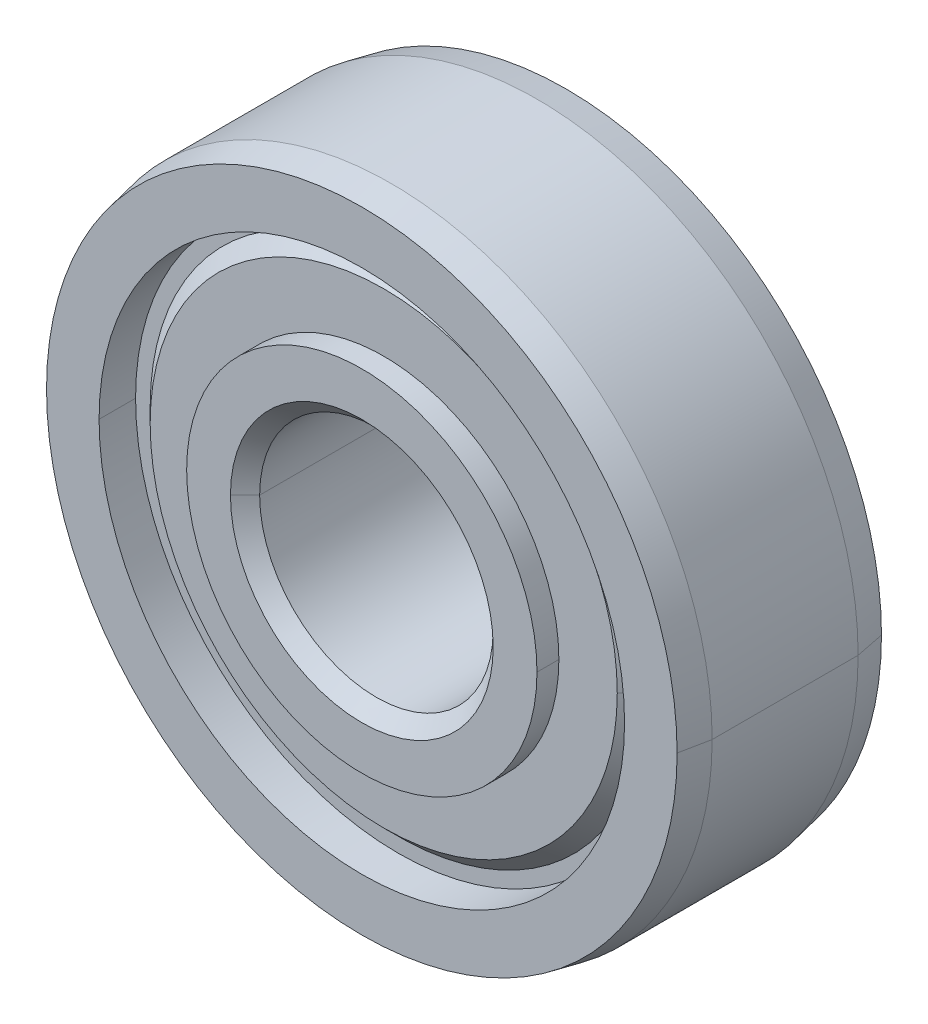
ISO-10303-21;
HEADER;
FILE_DESCRIPTION(('STEP AP214'),'2;1');
FILE_NAME('part.step','',(''),(''),'','','');
FILE_SCHEMA(('AUTOMOTIVE_DESIGN { 1 0 10303 214 1 1 1 1 }'));
ENDSEC;
DATA;
#1=APPLICATION_CONTEXT('core data for automotive mechanical design processes');
#2=APPLICATION_PROTOCOL_DEFINITION('international standard','automotive_design',2000,#1);
#3=PRODUCT_CONTEXT('',#1,'mechanical');
#4=PRODUCT('Part','Part','',(#3));
#5=PRODUCT_RELATED_PRODUCT_CATEGORY('part','',(#4));
#6=PRODUCT_DEFINITION_FORMATION('','',#4);
#7=PRODUCT_DEFINITION_CONTEXT('part definition',#1,'design');
#8=PRODUCT_DEFINITION('design','',#6,#7);
#9=PRODUCT_DEFINITION_SHAPE('','',#8);
#10=(LENGTH_UNIT() NAMED_UNIT(*) SI_UNIT(.MILLI.,.METRE.));
#11=(NAMED_UNIT(*) PLANE_ANGLE_UNIT() SI_UNIT($,.RADIAN.));
#12=(NAMED_UNIT(*) SI_UNIT($,.STERADIAN.) SOLID_ANGLE_UNIT());
#13=UNCERTAINTY_MEASURE_WITH_UNIT(LENGTH_MEASURE(1.E-05),#10,'distance_accuracy_value','');
#14=(GEOMETRIC_REPRESENTATION_CONTEXT(3) GLOBAL_UNCERTAINTY_ASSIGNED_CONTEXT((#13)) GLOBAL_UNIT_ASSIGNED_CONTEXT((#10,
#11,#12)) REPRESENTATION_CONTEXT('',''));
#15=CARTESIAN_POINT('',(0.,0.,0.));
#16=DIRECTION('',(0.,0.,1.));
#17=DIRECTION('',(1.,0.,0.));
#18=AXIS2_PLACEMENT_3D('',#15,#16,#17);
#19=CARTESIAN_POINT('',(0.,0.,-3.5));
#20=DIRECTION('',(0.,0.,1.));
#21=DIRECTION('',(1.,0.,0.));
#22=AXIS2_PLACEMENT_3D('',#19,#20,#21);
#23=PLANE('',#22);
#24=CARTESIAN_POINT('',(0.,0.,-3.5));
#25=DIRECTION('',(0.,0.,-1.));
#26=DIRECTION('',(-1.,0.,0.));
#27=AXIS2_PLACEMENT_3D('',#24,#25,#26);
#28=CIRCLE('',#27,9.);
#29=CARTESIAN_POINT('',(-9.,0.,-3.5));
#30=VERTEX_POINT('',#29);
#31=CARTESIAN_POINT('',(9.,0.,-3.5));
#32=VERTEX_POINT('',#31);
#33=EDGE_CURVE('E229',#30,#32,#28,.T.);
#34=ORIENTED_EDGE('',*,*,#33,.F.);
#35=CARTESIAN_POINT('',(0.,0.,-3.5));
#36=DIRECTION('',(0.,0.,-1.));
#37=DIRECTION('',(1.,0.,0.));
#38=AXIS2_PLACEMENT_3D('',#35,#36,#37);
#39=CIRCLE('',#38,9.);
#40=EDGE_CURVE('E36',#32,#30,#39,.T.);
#41=ORIENTED_EDGE('',*,*,#40,.F.);
#42=EDGE_LOOP('',(#34,#41));
#43=FACE_BOUND('',#42,.T.);
#44=CARTESIAN_POINT('',(0.,0.,-3.5));
#45=DIRECTION('',(0.,0.,-1.));
#46=DIRECTION('',(-1.,0.,0.));
#47=AXIS2_PLACEMENT_3D('',#44,#45,#46);
#48=CIRCLE('',#47,10.8);
#49=CARTESIAN_POINT('',(-10.7999999994736,-5.50684610769266E-07,-3.50000000263162));
#50=VERTEX_POINT('',#49);
#51=CARTESIAN_POINT('',(10.7999999994736,5.50684613076049E-07,-3.50000000263162));
#52=VERTEX_POINT('',#51);
#53=EDGE_CURVE('E10',#50,#52,#48,.T.);
#54=ORIENTED_EDGE('',*,*,#53,.T.);
#55=CARTESIAN_POINT('',(0.,0.,-3.5));
#56=DIRECTION('',(0.,0.,-1.));
#57=DIRECTION('',(1.,0.,0.));
#58=AXIS2_PLACEMENT_3D('',#55,#56,#57);
#59=CIRCLE('',#58,10.8);
#60=EDGE_CURVE('E27',#52,#50,#59,.T.);
#61=ORIENTED_EDGE('',*,*,#60,.T.);
#62=EDGE_LOOP('',(#54,#61));
#63=FACE_BOUND('',#62,.T.);
#64=ADVANCED_FACE('F16',(#43,#63),#23,.F.);
#65=CARTESIAN_POINT('',(0.,0.,-3.5));
#66=DIRECTION('',(0.,0.,-1.));
#67=DIRECTION('',(1.,0.,0.));
#68=AXIS2_PLACEMENT_3D('',#65,#66,#67);
#69=CYLINDRICAL_SURFACE('',#68,9.);
#70=ORIENTED_EDGE('',*,*,#33,.T.);
#71=DIRECTION('',(0.,0.,1.));
#72=VECTOR('',#71,1.);
#73=CARTESIAN_POINT('',(9.,0.,-3.5));
#74=LINE('',#73,#72);
#75=CARTESIAN_POINT('',(9.,0.,-2.25));
#76=VERTEX_POINT('',#75);
#77=EDGE_CURVE('E241',#32,#76,#74,.T.);
#78=ORIENTED_EDGE('',*,*,#77,.T.);
#79=CARTESIAN_POINT('',(0.,0.,-2.25));
#80=DIRECTION('',(0.,0.,1.));
#81=DIRECTION('',(1.,0.,0.));
#82=AXIS2_PLACEMENT_3D('',#79,#80,#81);
#83=CIRCLE('',#82,9.);
#84=CARTESIAN_POINT('',(-9.,0.,-2.25));
#85=VERTEX_POINT('',#84);
#86=EDGE_CURVE('E245',#76,#85,#83,.T.);
#87=ORIENTED_EDGE('',*,*,#86,.T.);
#88=DIRECTION('',(0.,0.,-1.));
#89=VECTOR('',#88,1.);
#90=CARTESIAN_POINT('',(-9.,0.,-2.25));
#91=LINE('',#90,#89);
#92=EDGE_CURVE('E260',#85,#30,#91,.T.);
#93=ORIENTED_EDGE('',*,*,#92,.T.);
#94=EDGE_LOOP('',(#70,#78,#87,#93));
#95=FACE_BOUND('',#94,.T.);
#96=ADVANCED_FACE('F470',(#95),#69,.F.);
#97=CARTESIAN_POINT('',(0.,0.,-3.5));
#98=DIRECTION('',(0.,0.,-1.));
#99=DIRECTION('',(1.,0.,0.));
#100=AXIS2_PLACEMENT_3D('',#97,#98,#99);
#101=CYLINDRICAL_SURFACE('',#100,9.);
#102=ORIENTED_EDGE('',*,*,#40,.T.);
#103=ORIENTED_EDGE('',*,*,#92,.F.);
#104=CARTESIAN_POINT('',(0.,0.,-2.25));
#105=DIRECTION('',(0.,0.,1.));
#106=DIRECTION('',(-1.,0.,0.));
#107=AXIS2_PLACEMENT_3D('',#104,#105,#106);
#108=CIRCLE('',#107,9.);
#109=EDGE_CURVE('E239',#85,#76,#108,.T.);
#110=ORIENTED_EDGE('',*,*,#109,.T.);
#111=ORIENTED_EDGE('',*,*,#77,.F.);
#112=EDGE_LOOP('',(#102,#103,#110,#111));
#113=FACE_BOUND('',#112,.T.);
#114=ADVANCED_FACE('F476',(#113),#101,.F.);
#115=CARTESIAN_POINT('',(0.,0.,-52.5));
#116=DIRECTION('',(0.,0.,1.));
#117=DIRECTION('',(0.,-1.,0.));
#118=AXIS2_PLACEMENT_3D('',#115,#116,#117);
#119=CONICAL_SURFACE('',#118,1.,0.19739555984988);
#120=DIRECTION('',(-0.196116135138183,-2.99994826555368E-08,0.98058067569092));
#121=VECTOR('',#120,1.);
#122=CARTESIAN_POINT('',(-10.7999999984209,-1.6520538323078E-06,-3.50000000789485));
#123=LINE('',#122,#121);
#124=CARTESIAN_POINT('',(-10.9999999995979,-4.20661854438411E-07,-2.50000000201026));
#125=VERTEX_POINT('',#124);
#126=EDGE_CURVE('E235',#50,#125,#123,.T.);
#127=ORIENTED_EDGE('',*,*,#126,.T.);
#128=CARTESIAN_POINT('',(0.,0.,-2.5));
#129=DIRECTION('',(0.,0.,-1.));
#130=DIRECTION('',(-1.,0.,0.));
#131=AXIS2_PLACEMENT_3D('',#128,#129,#130);
#132=CIRCLE('',#131,11.);
#133=CARTESIAN_POINT('',(10.9999999995979,4.20661856200537E-07,-2.50000000201026));
#134=VERTEX_POINT('',#133);
#135=EDGE_CURVE('E240',#125,#134,#132,.T.);
#136=ORIENTED_EDGE('',*,*,#135,.T.);
#137=DIRECTION('',(0.196116135138184,2.99994814602515E-08,0.98058067569092));
#138=VECTOR('',#137,1.);
#139=CARTESIAN_POINT('',(10.7999999984209,1.65205383922815E-06,-3.50000000789485));
#140=LINE('',#139,#138);
#141=EDGE_CURVE('E252',#52,#134,#140,.T.);
#142=ORIENTED_EDGE('',*,*,#141,.F.);
#143=ORIENTED_EDGE('',*,*,#53,.F.);
#144=EDGE_LOOP('',(#127,#136,#142,#143));
#145=FACE_BOUND('',#144,.T.);
#146=ADVANCED_FACE('F483',(#145),#119,.T.);
#147=CARTESIAN_POINT('',(0.,0.,-52.5));
#148=DIRECTION('',(0.,0.,1.));
#149=DIRECTION('',(0.,-1.,0.));
#150=AXIS2_PLACEMENT_3D('',#147,#148,#149);
#151=CONICAL_SURFACE('',#150,1.,0.19739555984988);
#152=ORIENTED_EDGE('',*,*,#141,.T.);
#153=CARTESIAN_POINT('',(0.,0.,-2.5));
#154=DIRECTION('',(0.,0.,-1.));
#155=DIRECTION('',(1.,0.,0.));
#156=AXIS2_PLACEMENT_3D('',#153,#154,#155);
#157=CIRCLE('',#156,11.);
#158=EDGE_CURVE('E256',#134,#125,#157,.T.);
#159=ORIENTED_EDGE('',*,*,#158,.T.);
#160=ORIENTED_EDGE('',*,*,#126,.F.);
#161=ORIENTED_EDGE('',*,*,#60,.F.);
#162=EDGE_LOOP('',(#152,#159,#160,#161));
#163=FACE_BOUND('',#162,.T.);
#164=ADVANCED_FACE('F486',(#163),#151,.T.);
#165=CARTESIAN_POINT('',(0.,0.,-2.25));
#166=DIRECTION('',(0.,0.,1.));
#167=DIRECTION('',(1.,0.,0.));
#168=AXIS2_PLACEMENT_3D('',#165,#166,#167);
#169=PLANE('',#168);
#170=CARTESIAN_POINT('',(0.,0.,-2.25));
#171=DIRECTION('',(0.,0.,-1.));
#172=DIRECTION('',(-1.,0.,0.));
#173=AXIS2_PLACEMENT_3D('',#170,#171,#172);
#174=CIRCLE('',#173,8.5);
#175=CARTESIAN_POINT('',(-8.49999999392348,-3.57447138303924E-07,-2.25000000607649));
#176=VERTEX_POINT('',#175);
#177=CARTESIAN_POINT('',(8.49999999392348,3.57447139280034E-07,-2.25000000607649));
#178=VERTEX_POINT('',#177);
#179=EDGE_CURVE('E271',#176,#178,#174,.T.);
#180=ORIENTED_EDGE('',*,*,#179,.F.);
#181=CARTESIAN_POINT('',(0.,0.,-2.25));
#182=DIRECTION('',(0.,0.,-1.));
#183=DIRECTION('',(1.,0.,0.));
#184=AXIS2_PLACEMENT_3D('',#181,#182,#183);
#185=CIRCLE('',#184,8.5);
#186=EDGE_CURVE('E275',#178,#176,#185,.T.);
#187=ORIENTED_EDGE('',*,*,#186,.F.);
#188=EDGE_LOOP('',(#180,#187));
#189=FACE_BOUND('',#188,.T.);
#190=ORIENTED_EDGE('',*,*,#109,.F.);
#191=ORIENTED_EDGE('',*,*,#86,.F.);
#192=EDGE_LOOP('',(#190,#191));
#193=FACE_BOUND('',#192,.T.);
#194=ADVANCED_FACE('F490',(#189,#193),#169,.F.);
#195=CARTESIAN_POINT('',(0.,0.,-3.5));
#196=DIRECTION('',(0.,0.,-1.));
#197=DIRECTION('',(1.,0.,0.));
#198=AXIS2_PLACEMENT_3D('',#195,#196,#197);
#199=CYLINDRICAL_SURFACE('',#198,11.);
#200=DIRECTION('',(0.,0.,1.));
#201=VECTOR('',#200,1.);
#202=CARTESIAN_POINT('',(11.,0.,-2.5));
#203=LINE('',#202,#201);
#204=CARTESIAN_POINT('',(10.9999999997759,-3.59110547667456E-07,2.50000000112059));
#205=VERTEX_POINT('',#204);
#206=EDGE_CURVE('E270',#134,#205,#203,.T.);
#207=ORIENTED_EDGE('',*,*,#206,.F.);
#208=ORIENTED_EDGE('',*,*,#135,.F.);
#209=DIRECTION('',(0.,0.,1.));
#210=VECTOR('',#209,1.);
#211=CARTESIAN_POINT('',(-11.,0.,-2.5));
#212=LINE('',#211,#210);
#213=CARTESIAN_POINT('',(-10.9999999997759,3.59110548145405E-07,2.50000000112059));
#214=VERTEX_POINT('',#213);
#215=EDGE_CURVE('E294',#125,#214,#212,.T.);
#216=ORIENTED_EDGE('',*,*,#215,.T.);
#217=CARTESIAN_POINT('',(0.,0.,2.5));
#218=DIRECTION('',(0.,0.,1.));
#219=DIRECTION('',(1.,0.,0.));
#220=AXIS2_PLACEMENT_3D('',#217,#218,#219);
#221=CIRCLE('',#220,11.);
#222=EDGE_CURVE('E225',#205,#214,#221,.T.);
#223=ORIENTED_EDGE('',*,*,#222,.F.);
#224=EDGE_LOOP('',(#207,#208,#216,#223));
#225=FACE_BOUND('',#224,.T.);
#226=ADVANCED_FACE('F500',(#225),#199,.T.);
#227=CARTESIAN_POINT('',(0.,0.,-3.5));
#228=DIRECTION('',(0.,0.,-1.));
#229=DIRECTION('',(1.,0.,0.));
#230=AXIS2_PLACEMENT_3D('',#227,#228,#229);
#231=CYLINDRICAL_SURFACE('',#230,11.);
#232=ORIENTED_EDGE('',*,*,#215,.F.);
#233=ORIENTED_EDGE('',*,*,#158,.F.);
#234=ORIENTED_EDGE('',*,*,#206,.T.);
#235=CARTESIAN_POINT('',(0.,0.,2.5));
#236=DIRECTION('',(0.,0.,1.));
#237=DIRECTION('',(-1.,0.,0.));
#238=AXIS2_PLACEMENT_3D('',#235,#236,#237);
#239=CIRCLE('',#238,11.);
#240=EDGE_CURVE('E226',#214,#205,#239,.T.);
#241=ORIENTED_EDGE('',*,*,#240,.F.);
#242=EDGE_LOOP('',(#232,#233,#234,#241));
#243=FACE_BOUND('',#242,.T.);
#244=ADVANCED_FACE('F504',(#243),#231,.T.);
#245=CARTESIAN_POINT('',(0.,0.,-9.75));
#246=DIRECTION('',(0.,0.,1.));
#247=DIRECTION('',(0.,-1.,0.));
#248=AXIS2_PLACEMENT_3D('',#245,#246,#247);
#249=CONICAL_SURFACE('',#248,1.,0.785398163397448);
#250=DIRECTION('',(-0.707106781186542,-8.92070456302929E-08,0.707106781186547));
#251=VECTOR('',#250,1.);
#252=CARTESIAN_POINT('',(-7.99999998284277,-1.00926250815226E-06,-2.75000001715717));
#253=LINE('',#252,#251);
#254=CARTESIAN_POINT('',(-7.99999999428092,-3.36420836050752E-07,-2.75000000571906));
#255=VERTEX_POINT('',#254);
#256=EDGE_CURVE('E266',#255,#176,#253,.T.);
#257=ORIENTED_EDGE('',*,*,#256,.T.);
#258=ORIENTED_EDGE('',*,*,#179,.T.);
#259=DIRECTION('',(0.707106781186542,8.92070458738981E-08,0.707106781186547));
#260=VECTOR('',#259,1.);
#261=CARTESIAN_POINT('',(7.99999998284277,1.00926251090833E-06,-2.75000001715717));
#262=LINE('',#261,#260);
#263=CARTESIAN_POINT('',(7.99999999428092,3.36420836969444E-07,-2.75000000571906));
#264=VERTEX_POINT('',#263);
#265=EDGE_CURVE('E278',#264,#178,#262,.T.);
#266=ORIENTED_EDGE('',*,*,#265,.F.);
#267=CARTESIAN_POINT('',(0.,0.,-2.75));
#268=DIRECTION('',(0.,0.,-1.));
#269=DIRECTION('',(-1.,0.,0.));
#270=AXIS2_PLACEMENT_3D('',#267,#268,#269);
#271=CIRCLE('',#270,8.);
#272=EDGE_CURVE('E314',#255,#264,#271,.T.);
#273=ORIENTED_EDGE('',*,*,#272,.F.);
#274=EDGE_LOOP('',(#257,#258,#266,#273));
#275=FACE_BOUND('',#274,.T.);
#276=ADVANCED_FACE('F496',(#275),#249,.T.);
#277=CARTESIAN_POINT('',(0.,0.,-9.75));
#278=DIRECTION('',(0.,0.,1.));
#279=DIRECTION('',(0.,-1.,0.));
#280=AXIS2_PLACEMENT_3D('',#277,#278,#279);
#281=CONICAL_SURFACE('',#280,1.,0.785398163397448);
#282=ORIENTED_EDGE('',*,*,#265,.T.);
#283=ORIENTED_EDGE('',*,*,#186,.T.);
#284=ORIENTED_EDGE('',*,*,#256,.F.);
#285=CARTESIAN_POINT('',(0.,0.,-2.75));
#286=DIRECTION('',(0.,0.,-1.));
#287=DIRECTION('',(1.,0.,0.));
#288=AXIS2_PLACEMENT_3D('',#285,#286,#287);
#289=CIRCLE('',#288,8.);
#290=EDGE_CURVE('E320',#264,#255,#289,.T.);
#291=ORIENTED_EDGE('',*,*,#290,.F.);
#292=EDGE_LOOP('',(#282,#283,#284,#291));
#293=FACE_BOUND('',#292,.T.);
#294=ADVANCED_FACE('F492',(#293),#281,.T.);
#295=CARTESIAN_POINT('',(0.,0.,52.5));
#296=DIRECTION('',(0.,0.,-1.));
#297=DIRECTION('',(0.,-1.,0.));
#298=AXIS2_PLACEMENT_3D('',#295,#296,#297);
#299=CONICAL_SURFACE('',#298,1.,0.19739555984988);
#300=DIRECTION('',(0.196116135138182,-2.56099536616518E-08,-0.98058067569092));
#301=VECTOR('',#300,1.);
#302=CARTESIAN_POINT('',(10.7999999991197,-1.41032505728514E-06,3.50000000440085));
#303=LINE('',#302,#301);
#304=CARTESIAN_POINT('',(10.7999999997066,-4.7010835242838E-07,3.50000000146695));
#305=VERTEX_POINT('',#304);
#306=EDGE_CURVE('E279',#305,#205,#303,.T.);
#307=ORIENTED_EDGE('',*,*,#306,.T.);
#308=ORIENTED_EDGE('',*,*,#222,.T.);
#309=DIRECTION('',(-0.196116135138182,2.56099500232726E-08,-0.98058067569092));
#310=VECTOR('',#309,1.);
#311=CARTESIAN_POINT('',(-10.7999999991197,1.41032506156025E-06,3.50000000440085));
#312=LINE('',#311,#310);
#313=CARTESIAN_POINT('',(-10.7999999997066,4.70108353853417E-07,3.50000000146695));
#314=VERTEX_POINT('',#313);
#315=EDGE_CURVE('E221',#314,#214,#312,.T.);
#316=ORIENTED_EDGE('',*,*,#315,.F.);
#317=CARTESIAN_POINT('',(0.,0.,3.5));
#318=DIRECTION('',(0.,0.,1.));
#319=DIRECTION('',(1.,0.,0.));
#320=AXIS2_PLACEMENT_3D('',#317,#318,#319);
#321=CIRCLE('',#320,10.8);
#322=EDGE_CURVE('E230',#305,#314,#321,.T.);
#323=ORIENTED_EDGE('',*,*,#322,.F.);
#324=EDGE_LOOP('',(#307,#308,#316,#323));
#325=FACE_BOUND('',#324,.T.);
#326=ADVANCED_FACE('F495',(#325),#299,.T.);
#327=CARTESIAN_POINT('',(0.,0.,52.5));
#328=DIRECTION('',(0.,0.,-1.));
#329=DIRECTION('',(0.,-1.,0.));
#330=AXIS2_PLACEMENT_3D('',#327,#328,#329);
#331=CONICAL_SURFACE('',#330,1.,0.19739555984988);
#332=ORIENTED_EDGE('',*,*,#315,.T.);
#333=ORIENTED_EDGE('',*,*,#240,.T.);
#334=ORIENTED_EDGE('',*,*,#306,.F.);
#335=CARTESIAN_POINT('',(0.,0.,3.5));
#336=DIRECTION('',(0.,0.,1.));
#337=DIRECTION('',(-1.,0.,0.));
#338=AXIS2_PLACEMENT_3D('',#335,#336,#337);
#339=CIRCLE('',#338,10.8);
#340=EDGE_CURVE('E234',#314,#305,#339,.T.);
#341=ORIENTED_EDGE('',*,*,#340,.F.);
#342=EDGE_LOOP('',(#332,#333,#334,#341));
#343=FACE_BOUND('',#342,.T.);
#344=ADVANCED_FACE('F520',(#343),#331,.T.);
#345=CARTESIAN_POINT('',(0.,0.,-2.75));
#346=DIRECTION('',(0.,0.,1.));
#347=DIRECTION('',(1.,0.,0.));
#348=AXIS2_PLACEMENT_3D('',#345,#346,#347);
#349=PLANE('',#348);
#350=ORIENTED_EDGE('',*,*,#272,.T.);
#351=ORIENTED_EDGE('',*,*,#290,.T.);
#352=EDGE_LOOP('',(#350,#351));
#353=FACE_BOUND('',#352,.T.);
#354=CARTESIAN_POINT('',(0.,0.,-2.75));
#355=DIRECTION('',(0.,0.,1.));
#356=DIRECTION('',(-1.,0.,0.));
#357=AXIS2_PLACEMENT_3D('',#354,#355,#356);
#358=CIRCLE('',#357,6.);
#359=CARTESIAN_POINT('',(-6.,0.,-2.75));
#360=VERTEX_POINT('',#359);
#361=CARTESIAN_POINT('',(6.,0.,-2.75));
#362=VERTEX_POINT('',#361);
#363=EDGE_CURVE('E324',#360,#362,#358,.T.);
#364=ORIENTED_EDGE('',*,*,#363,.T.);
#365=CARTESIAN_POINT('',(0.,0.,-2.75));
#366=DIRECTION('',(0.,0.,1.));
#367=DIRECTION('',(1.,0.,0.));
#368=AXIS2_PLACEMENT_3D('',#365,#366,#367);
#369=CIRCLE('',#368,6.);
#370=EDGE_CURVE('E338',#362,#360,#369,.T.);
#371=ORIENTED_EDGE('',*,*,#370,.T.);
#372=EDGE_LOOP('',(#364,#371));
#373=FACE_BOUND('',#372,.T.);
#374=ADVANCED_FACE('F524',(#353,#373),#349,.F.);
#375=CARTESIAN_POINT('',(0.,0.,3.5));
#376=DIRECTION('',(0.,0.,1.));
#377=DIRECTION('',(1.,0.,0.));
#378=AXIS2_PLACEMENT_3D('',#375,#376,#377);
#379=PLANE('',#378);
#380=CARTESIAN_POINT('',(0.,0.,3.5));
#381=DIRECTION('',(0.,0.,-1.));
#382=DIRECTION('',(-1.,0.,0.));
#383=AXIS2_PLACEMENT_3D('',#380,#381,#382);
#384=CIRCLE('',#383,9.);
#385=CARTESIAN_POINT('',(-9.,0.,3.5));
#386=VERTEX_POINT('',#385);
#387=CARTESIAN_POINT('',(9.,0.,3.5));
#388=VERTEX_POINT('',#387);
#389=EDGE_CURVE('E341',#386,#388,#384,.T.);
#390=ORIENTED_EDGE('',*,*,#389,.T.);
#391=CARTESIAN_POINT('',(0.,0.,3.5));
#392=DIRECTION('',(0.,0.,-1.));
#393=DIRECTION('',(1.,0.,0.));
#394=AXIS2_PLACEMENT_3D('',#391,#392,#393);
#395=CIRCLE('',#394,9.);
#396=EDGE_CURVE('E233',#388,#386,#395,.T.);
#397=ORIENTED_EDGE('',*,*,#396,.T.);
#398=EDGE_LOOP('',(#390,#397));
#399=FACE_BOUND('',#398,.T.);
#400=ORIENTED_EDGE('',*,*,#322,.T.);
#401=ORIENTED_EDGE('',*,*,#340,.T.);
#402=EDGE_LOOP('',(#400,#401));
#403=FACE_BOUND('',#402,.T.);
#404=ADVANCED_FACE('F513',(#399,#403),#379,.T.);
#405=CARTESIAN_POINT('',(0.,0.,-3.5));
#406=DIRECTION('',(0.,0.,-1.));
#407=DIRECTION('',(1.,0.,0.));
#408=AXIS2_PLACEMENT_3D('',#405,#406,#407);
#409=CYLINDRICAL_SURFACE('',#408,6.);
#410=DIRECTION('',(0.,0.,1.));
#411=VECTOR('',#410,1.);
#412=CARTESIAN_POINT('',(-6.,0.,-3.5));
#413=LINE('',#412,#411);
#414=CARTESIAN_POINT('',(-6.,0.,-3.5));
#415=VERTEX_POINT('',#414);
#416=EDGE_CURVE('E220',#415,#360,#413,.T.);
#417=ORIENTED_EDGE('',*,*,#416,.F.);
#418=CARTESIAN_POINT('',(0.,0.,-3.5));
#419=DIRECTION('',(0.,0.,1.));
#420=DIRECTION('',(-1.,0.,0.));
#421=AXIS2_PLACEMENT_3D('',#418,#419,#420);
#422=CIRCLE('',#421,6.);
#423=CARTESIAN_POINT('',(6.,0.,-3.5));
#424=VERTEX_POINT('',#423);
#425=EDGE_CURVE('E334',#415,#424,#422,.T.);
#426=ORIENTED_EDGE('',*,*,#425,.T.);
#427=DIRECTION('',(0.,0.,1.));
#428=VECTOR('',#427,1.);
#429=CARTESIAN_POINT('',(6.,0.,-3.5));
#430=LINE('',#429,#428);
#431=EDGE_CURVE('E219',#424,#362,#430,.T.);
#432=ORIENTED_EDGE('',*,*,#431,.T.);
#433=ORIENTED_EDGE('',*,*,#363,.F.);
#434=EDGE_LOOP('',(#417,#426,#432,#433));
#435=FACE_BOUND('',#434,.T.);
#436=ADVANCED_FACE('F509',(#435),#409,.T.);
#437=CARTESIAN_POINT('',(0.,0.,-3.5));
#438=DIRECTION('',(0.,0.,-1.));
#439=DIRECTION('',(1.,0.,0.));
#440=AXIS2_PLACEMENT_3D('',#437,#438,#439);
#441=CYLINDRICAL_SURFACE('',#440,6.);
#442=ORIENTED_EDGE('',*,*,#431,.F.);
#443=CARTESIAN_POINT('',(0.,0.,-3.5));
#444=DIRECTION('',(0.,0.,1.));
#445=DIRECTION('',(1.,0.,0.));
#446=AXIS2_PLACEMENT_3D('',#443,#444,#445);
#447=CIRCLE('',#446,6.);
#448=EDGE_CURVE('E216',#424,#415,#447,.T.);
#449=ORIENTED_EDGE('',*,*,#448,.T.);
#450=ORIENTED_EDGE('',*,*,#416,.T.);
#451=ORIENTED_EDGE('',*,*,#370,.F.);
#452=EDGE_LOOP('',(#442,#449,#450,#451));
#453=FACE_BOUND('',#452,.T.);
#454=ADVANCED_FACE('F512',(#453),#441,.T.);
#455=CARTESIAN_POINT('',(0.,0.,-3.5));
#456=DIRECTION('',(0.,0.,-1.));
#457=DIRECTION('',(1.,0.,0.));
#458=AXIS2_PLACEMENT_3D('',#455,#456,#457);
#459=CYLINDRICAL_SURFACE('',#458,9.);
#460=ORIENTED_EDGE('',*,*,#389,.F.);
#461=DIRECTION('',(0.,0.,-1.));
#462=VECTOR('',#461,1.);
#463=CARTESIAN_POINT('',(-9.,0.,3.5));
#464=LINE('',#463,#462);
#465=CARTESIAN_POINT('',(-9.,0.,2.25));
#466=VERTEX_POINT('',#465);
#467=EDGE_CURVE('E353',#386,#466,#464,.T.);
#468=ORIENTED_EDGE('',*,*,#467,.T.);
#469=CARTESIAN_POINT('',(0.,0.,2.25));
#470=DIRECTION('',(0.,0.,1.));
#471=DIRECTION('',(1.,0.,0.));
#472=AXIS2_PLACEMENT_3D('',#469,#470,#471);
#473=CIRCLE('',#472,9.);
#474=CARTESIAN_POINT('',(9.,0.,2.25));
#475=VERTEX_POINT('',#474);
#476=EDGE_CURVE('E301',#475,#466,#473,.T.);
#477=ORIENTED_EDGE('',*,*,#476,.F.);
#478=DIRECTION('',(0.,0.,1.));
#479=VECTOR('',#478,1.);
#480=CARTESIAN_POINT('',(9.,0.,2.25));
#481=LINE('',#480,#479);
#482=EDGE_CURVE('E284',#475,#388,#481,.T.);
#483=ORIENTED_EDGE('',*,*,#482,.T.);
#484=EDGE_LOOP('',(#460,#468,#477,#483));
#485=FACE_BOUND('',#484,.T.);
#486=ADVANCED_FACE('F528',(#485),#459,.F.);
#487=CARTESIAN_POINT('',(0.,0.,-3.5));
#488=DIRECTION('',(0.,0.,-1.));
#489=DIRECTION('',(1.,0.,0.));
#490=AXIS2_PLACEMENT_3D('',#487,#488,#489);
#491=CYLINDRICAL_SURFACE('',#490,9.);
#492=ORIENTED_EDGE('',*,*,#396,.F.);
#493=ORIENTED_EDGE('',*,*,#482,.F.);
#494=CARTESIAN_POINT('',(0.,0.,2.25));
#495=DIRECTION('',(0.,0.,1.));
#496=DIRECTION('',(-1.,0.,0.));
#497=AXIS2_PLACEMENT_3D('',#494,#495,#496);
#498=CIRCLE('',#497,9.);
#499=EDGE_CURVE('E304',#466,#475,#498,.T.);
#500=ORIENTED_EDGE('',*,*,#499,.F.);
#501=ORIENTED_EDGE('',*,*,#467,.F.);
#502=EDGE_LOOP('',(#492,#493,#500,#501));
#503=FACE_BOUND('',#502,.T.);
#504=ADVANCED_FACE('F534',(#503),#491,.F.);
#505=CARTESIAN_POINT('',(0.,0.,-3.5));
#506=DIRECTION('',(0.,0.,1.));
#507=DIRECTION('',(1.,0.,0.));
#508=AXIS2_PLACEMENT_3D('',#505,#506,#507);
#509=PLANE('',#508);
#510=CARTESIAN_POINT('',(0.,0.,-3.5));
#511=DIRECTION('',(0.,0.,1.));
#512=DIRECTION('',(1.,0.,0.));
#513=AXIS2_PLACEMENT_3D('',#510,#511,#512);
#514=CIRCLE('',#513,4.5);
#515=CARTESIAN_POINT('',(4.49999997643556,-8.34049497778793E-07,-3.49999997643579));
#516=VERTEX_POINT('',#515);
#517=CARTESIAN_POINT('',(-4.49999997643556,8.34049497595097E-07,-3.49999997643579));
#518=VERTEX_POINT('',#517);
#519=EDGE_CURVE('E280',#516,#518,#514,.T.);
#520=ORIENTED_EDGE('',*,*,#519,.T.);
#521=CARTESIAN_POINT('',(0.,0.,-3.5));
#522=DIRECTION('',(0.,0.,1.));
#523=DIRECTION('',(-1.,0.,0.));
#524=AXIS2_PLACEMENT_3D('',#521,#522,#523);
#525=CIRCLE('',#524,4.5);
#526=EDGE_CURVE('E285',#518,#516,#525,.T.);
#527=ORIENTED_EDGE('',*,*,#526,.T.);
#528=EDGE_LOOP('',(#520,#527));
#529=FACE_BOUND('',#528,.T.);
#530=ORIENTED_EDGE('',*,*,#425,.F.);
#531=ORIENTED_EDGE('',*,*,#448,.F.);
#532=EDGE_LOOP('',(#530,#531));
#533=FACE_BOUND('',#532,.T.);
#534=ADVANCED_FACE('F530',(#529,#533),#509,.F.);
#535=CARTESIAN_POINT('',(0.,0.,2.25));
#536=DIRECTION('',(0.,0.,1.));
#537=DIRECTION('',(1.,0.,0.));
#538=AXIS2_PLACEMENT_3D('',#535,#536,#537);
#539=PLANE('',#538);
#540=CARTESIAN_POINT('',(0.,0.,2.25));
#541=DIRECTION('',(0.,0.,1.));
#542=DIRECTION('',(1.,0.,0.));
#543=AXIS2_PLACEMENT_3D('',#540,#541,#542);
#544=CIRCLE('',#543,8.5);
#545=CARTESIAN_POINT('',(8.4999999965269,-3.19631542311548E-07,2.25000000347308));
#546=VERTEX_POINT('',#545);
#547=CARTESIAN_POINT('',(-8.4999999965269,3.19631541964565E-07,2.25000000347308));
#548=VERTEX_POINT('',#547);
#549=EDGE_CURVE('E251',#546,#548,#544,.T.);
#550=ORIENTED_EDGE('',*,*,#549,.F.);
#551=CARTESIAN_POINT('',(0.,0.,2.25));
#552=DIRECTION('',(0.,0.,1.));
#553=DIRECTION('',(-1.,0.,0.));
#554=AXIS2_PLACEMENT_3D('',#551,#552,#553);
#555=CIRCLE('',#554,8.5);
#556=EDGE_CURVE('E261',#548,#546,#555,.T.);
#557=ORIENTED_EDGE('',*,*,#556,.F.);
#558=EDGE_LOOP('',(#550,#557));
#559=FACE_BOUND('',#558,.T.);
#560=ORIENTED_EDGE('',*,*,#499,.T.);
#561=ORIENTED_EDGE('',*,*,#476,.T.);
#562=EDGE_LOOP('',(#560,#561));
#563=FACE_BOUND('',#562,.T.);
#564=ADVANCED_FACE('F533',(#559,#563),#539,.T.);
#565=CARTESIAN_POINT('',(0.,0.,0.));
#566=DIRECTION('',(0.,0.,-1.));
#567=DIRECTION('',(0.,-1.,0.));
#568=AXIS2_PLACEMENT_3D('',#565,#566,#567);
#569=CONICAL_SURFACE('',#568,1.,0.785398163397449);
#570=DIRECTION('',(-0.707106781186439,3.93174708736907E-07,0.707106781186547));
#571=VECTOR('',#570,1.);
#572=CARTESIAN_POINT('',(4.49999992930666,-2.50214849333638E-06,-3.49999992930735));
#573=LINE('',#572,#571);
#574=CARTESIAN_POINT('',(3.99999998429037,-5.56032999231099E-07,-2.99999998429052));
#575=VERTEX_POINT('',#574);
#576=EDGE_CURVE('E305',#516,#575,#573,.T.);
#577=ORIENTED_EDGE('',*,*,#576,.T.);
#578=CARTESIAN_POINT('',(0.,0.,-3.));
#579=DIRECTION('',(0.,0.,1.));
#580=DIRECTION('',(1.,0.,0.));
#581=AXIS2_PLACEMENT_3D('',#578,#579,#580);
#582=CIRCLE('',#581,4.);
#583=CARTESIAN_POINT('',(-3.99999998429037,5.56032998986169E-07,-2.99999998429052));
#584=VERTEX_POINT('',#583);
#585=EDGE_CURVE('E374',#575,#584,#582,.T.);
#586=ORIENTED_EDGE('',*,*,#585,.T.);
#587=DIRECTION('',(0.707106781186438,-3.93174708650313E-07,0.707106781186548));
#588=VECTOR('',#587,1.);
#589=CARTESIAN_POINT('',(-4.49999992930666,2.50214849278529E-06,-3.49999992930735));
#590=LINE('',#589,#588);
#591=EDGE_CURVE('E330',#518,#584,#590,.T.);
#592=ORIENTED_EDGE('',*,*,#591,.F.);
#593=ORIENTED_EDGE('',*,*,#519,.F.);
#594=EDGE_LOOP('',(#577,#586,#592,#593));
#595=FACE_BOUND('',#594,.T.);
#596=ADVANCED_FACE('F550',(#595),#569,.F.);
#597=CARTESIAN_POINT('',(0.,0.,0.));
#598=DIRECTION('',(0.,0.,-1.));
#599=DIRECTION('',(0.,-1.,0.));
#600=AXIS2_PLACEMENT_3D('',#597,#598,#599);
#601=CONICAL_SURFACE('',#600,1.,0.785398163397449);
#602=ORIENTED_EDGE('',*,*,#591,.T.);
#603=CARTESIAN_POINT('',(0.,0.,-3.));
#604=DIRECTION('',(0.,0.,1.));
#605=DIRECTION('',(-1.,0.,0.));
#606=AXIS2_PLACEMENT_3D('',#603,#604,#605);
#607=CIRCLE('',#606,4.);
#608=EDGE_CURVE('E250',#584,#575,#607,.T.);
#609=ORIENTED_EDGE('',*,*,#608,.T.);
#610=ORIENTED_EDGE('',*,*,#576,.F.);
#611=ORIENTED_EDGE('',*,*,#526,.F.);
#612=EDGE_LOOP('',(#602,#609,#610,#611));
#613=FACE_BOUND('',#612,.T.);
#614=ADVANCED_FACE('F554',(#613),#601,.F.);
#615=CARTESIAN_POINT('',(0.,0.,9.75));
#616=DIRECTION('',(0.,0.,-1.));
#617=DIRECTION('',(0.,-1.,0.));
#618=AXIS2_PLACEMENT_3D('',#615,#616,#617);
#619=CONICAL_SURFACE('',#618,1.,0.785398163397448);
#620=DIRECTION('',(0.707106781186542,-7.97695144266721E-08,-0.707106781186549));
#621=VECTOR('',#620,1.);
#622=CARTESIAN_POINT('',(7.99999999019359,-9.02489062420728E-07,2.75000000980635));
#623=LINE('',#622,#621);
#624=CARTESIAN_POINT('',(7.9999999967312,-3.00829687473576E-07,2.75000000326878));
#625=VERTEX_POINT('',#624);
#626=EDGE_CURVE('E246',#625,#546,#623,.T.);
#627=ORIENTED_EDGE('',*,*,#626,.T.);
#628=ORIENTED_EDGE('',*,*,#549,.T.);
#629=DIRECTION('',(-0.707106781186542,7.97695143400763E-08,-0.707106781186549));
#630=VECTOR('',#629,1.);
#631=CARTESIAN_POINT('',(-7.99999999019359,9.02489061441011E-07,2.75000000980635));
#632=LINE('',#631,#630);
#633=CARTESIAN_POINT('',(-7.9999999967312,3.00829687147004E-07,2.75000000326878));
#634=VERTEX_POINT('',#633);
#635=EDGE_CURVE('E264',#634,#548,#632,.T.);
#636=ORIENTED_EDGE('',*,*,#635,.F.);
#637=CARTESIAN_POINT('',(0.,0.,2.75));
#638=DIRECTION('',(0.,0.,1.));
#639=DIRECTION('',(1.,0.,0.));
#640=AXIS2_PLACEMENT_3D('',#637,#638,#639);
#641=CIRCLE('',#640,8.);
#642=EDGE_CURVE('E381',#625,#634,#641,.T.);
#643=ORIENTED_EDGE('',*,*,#642,.F.);
#644=EDGE_LOOP('',(#627,#628,#636,#643));
#645=FACE_BOUND('',#644,.T.);
#646=ADVANCED_FACE('F558',(#645),#619,.T.);
#647=CARTESIAN_POINT('',(0.,0.,9.75));
#648=DIRECTION('',(0.,0.,-1.));
#649=DIRECTION('',(0.,-1.,0.));
#650=AXIS2_PLACEMENT_3D('',#647,#648,#649);
#651=CONICAL_SURFACE('',#650,1.,0.785398163397448);
#652=ORIENTED_EDGE('',*,*,#635,.T.);
#653=ORIENTED_EDGE('',*,*,#556,.T.);
#654=ORIENTED_EDGE('',*,*,#626,.F.);
#655=CARTESIAN_POINT('',(0.,0.,2.75));
#656=DIRECTION('',(0.,0.,1.));
#657=DIRECTION('',(-1.,0.,0.));
#658=AXIS2_PLACEMENT_3D('',#655,#656,#657);
#659=CIRCLE('',#658,8.);
#660=EDGE_CURVE('E202',#634,#625,#659,.T.);
#661=ORIENTED_EDGE('',*,*,#660,.F.);
#662=EDGE_LOOP('',(#652,#653,#654,#661));
#663=FACE_BOUND('',#662,.T.);
#664=ADVANCED_FACE('F562',(#663),#651,.T.);
#665=CARTESIAN_POINT('',(0.,0.,-3.5));
#666=DIRECTION('',(0.,0.,-1.));
#667=DIRECTION('',(1.,0.,0.));
#668=AXIS2_PLACEMENT_3D('',#665,#666,#667);
#669=CYLINDRICAL_SURFACE('',#668,4.);
#670=DIRECTION('',(0.,0.,1.));
#671=VECTOR('',#670,1.);
#672=CARTESIAN_POINT('',(-4.,0.,-3.));
#673=LINE('',#672,#671);
#674=CARTESIAN_POINT('',(-3.99999997592743,-4.61619713892376E-07,2.99999997592754));
#675=VERTEX_POINT('',#674);
#676=EDGE_CURVE('E384',#584,#675,#673,.T.);
#677=ORIENTED_EDGE('',*,*,#676,.F.);
#678=ORIENTED_EDGE('',*,*,#585,.F.);
#679=DIRECTION('',(0.,0.,1.));
#680=VECTOR('',#679,1.);
#681=CARTESIAN_POINT('',(4.,0.,-3.));
#682=LINE('',#681,#680);
#683=CARTESIAN_POINT('',(3.99999997592743,4.61619713892376E-07,2.99999997592754));
#684=VERTEX_POINT('',#683);
#685=EDGE_CURVE('E265',#575,#684,#682,.T.);
#686=ORIENTED_EDGE('',*,*,#685,.T.);
#687=CARTESIAN_POINT('',(0.,0.,3.));
#688=DIRECTION('',(0.,0.,-1.));
#689=DIRECTION('',(-1.,0.,0.));
#690=AXIS2_PLACEMENT_3D('',#687,#688,#689);
#691=CIRCLE('',#690,4.);
#692=EDGE_CURVE('E199',#675,#684,#691,.T.);
#693=ORIENTED_EDGE('',*,*,#692,.F.);
#694=EDGE_LOOP('',(#677,#678,#686,#693));
#695=FACE_BOUND('',#694,.T.);
#696=ADVANCED_FACE('F455',(#695),#669,.F.);
#697=CARTESIAN_POINT('',(0.,0.,-3.5));
#698=DIRECTION('',(0.,0.,-1.));
#699=DIRECTION('',(1.,0.,0.));
#700=AXIS2_PLACEMENT_3D('',#697,#698,#699);
#701=CYLINDRICAL_SURFACE('',#700,4.);
#702=ORIENTED_EDGE('',*,*,#685,.F.);
#703=ORIENTED_EDGE('',*,*,#608,.F.);
#704=ORIENTED_EDGE('',*,*,#676,.T.);
#705=CARTESIAN_POINT('',(0.,0.,3.));
#706=DIRECTION('',(0.,0.,-1.));
#707=DIRECTION('',(1.,0.,0.));
#708=AXIS2_PLACEMENT_3D('',#705,#706,#707);
#709=CIRCLE('',#708,4.);
#710=EDGE_CURVE('E171',#684,#675,#709,.T.);
#711=ORIENTED_EDGE('',*,*,#710,.F.);
#712=EDGE_LOOP('',(#702,#703,#704,#711));
#713=FACE_BOUND('',#712,.T.);
#714=ADVANCED_FACE('F457',(#713),#701,.F.);
#715=CARTESIAN_POINT('',(0.,0.,2.75));
#716=DIRECTION('',(0.,0.,1.));
#717=DIRECTION('',(1.,0.,0.));
#718=AXIS2_PLACEMENT_3D('',#715,#716,#717);
#719=PLANE('',#718);
#720=ORIENTED_EDGE('',*,*,#642,.T.);
#721=ORIENTED_EDGE('',*,*,#660,.T.);
#722=EDGE_LOOP('',(#720,#721));
#723=FACE_BOUND('',#722,.T.);
#724=CARTESIAN_POINT('',(0.,0.,2.75));
#725=DIRECTION('',(0.,0.,1.));
#726=DIRECTION('',(-1.,0.,0.));
#727=AXIS2_PLACEMENT_3D('',#724,#725,#726);
#728=CIRCLE('',#727,6.);
#729=CARTESIAN_POINT('',(-6.,0.,2.75));
#730=VERTEX_POINT('',#729);
#731=CARTESIAN_POINT('',(6.,0.,2.75));
#732=VERTEX_POINT('',#731);
#733=EDGE_CURVE('E168',#730,#732,#728,.T.);
#734=ORIENTED_EDGE('',*,*,#733,.F.);
#735=CARTESIAN_POINT('',(0.,0.,2.75));
#736=DIRECTION('',(0.,0.,1.));
#737=DIRECTION('',(1.,0.,0.));
#738=AXIS2_PLACEMENT_3D('',#735,#736,#737);
#739=CIRCLE('',#738,6.);
#740=EDGE_CURVE('E187',#732,#730,#739,.T.);
#741=ORIENTED_EDGE('',*,*,#740,.F.);
#742=EDGE_LOOP('',(#734,#741));
#743=FACE_BOUND('',#742,.T.);
#744=ADVANCED_FACE('F467',(#723,#743),#719,.T.);
#745=CARTESIAN_POINT('',(0.,0.,0.));
#746=DIRECTION('',(0.,0.,1.));
#747=DIRECTION('',(0.,-1.,0.));
#748=AXIS2_PLACEMENT_3D('',#745,#746,#747);
#749=CONICAL_SURFACE('',#748,1.,0.785398163397448);
#750=DIRECTION('',(0.707106781186472,3.26414438140079E-07,-0.707106781186548));
#751=VECTOR('',#750,1.);
#752=CARTESIAN_POINT('',(-4.49999989167344,-2.07728871416896E-06,3.49999989167392));
#753=LINE('',#752,#751);
#754=CARTESIAN_POINT('',(-4.49999996389115,-6.92429571389655E-07,3.4999999638913));
#755=VERTEX_POINT('',#754);
#756=EDGE_CURVE('E201',#755,#675,#753,.T.);
#757=ORIENTED_EDGE('',*,*,#756,.T.);
#758=ORIENTED_EDGE('',*,*,#692,.T.);
#759=DIRECTION('',(-0.707106781186472,-3.26414438226674E-07,-0.707106781186548));
#760=VECTOR('',#759,1.);
#761=CARTESIAN_POINT('',(4.49999989167345,2.07728871472006E-06,3.49999989167392));
#762=LINE('',#761,#760);
#763=CARTESIAN_POINT('',(4.49999996389115,6.92429571573352E-07,3.49999996389131));
#764=VERTEX_POINT('',#763);
#765=EDGE_CURVE('E203',#764,#684,#762,.T.);
#766=ORIENTED_EDGE('',*,*,#765,.F.);
#767=CARTESIAN_POINT('',(0.,0.,3.5));
#768=DIRECTION('',(0.,0.,-1.));
#769=DIRECTION('',(-1.,0.,0.));
#770=AXIS2_PLACEMENT_3D('',#767,#768,#769);
#771=CIRCLE('',#770,4.5);
#772=EDGE_CURVE('E150',#755,#764,#771,.T.);
#773=ORIENTED_EDGE('',*,*,#772,.F.);
#774=EDGE_LOOP('',(#757,#758,#766,#773));
#775=FACE_BOUND('',#774,.T.);
#776=ADVANCED_FACE('F458',(#775),#749,.F.);
#777=CARTESIAN_POINT('',(0.,0.,0.));
#778=DIRECTION('',(0.,0.,1.));
#779=DIRECTION('',(0.,-1.,0.));
#780=AXIS2_PLACEMENT_3D('',#777,#778,#779);
#781=CONICAL_SURFACE('',#780,1.,0.785398163397448);
#782=ORIENTED_EDGE('',*,*,#765,.T.);
#783=ORIENTED_EDGE('',*,*,#710,.T.);
#784=ORIENTED_EDGE('',*,*,#756,.F.);
#785=CARTESIAN_POINT('',(0.,0.,3.5));
#786=DIRECTION('',(0.,0.,-1.));
#787=DIRECTION('',(1.,0.,0.));
#788=AXIS2_PLACEMENT_3D('',#785,#786,#787);
#789=CIRCLE('',#788,4.5);
#790=EDGE_CURVE('E162',#764,#755,#789,.T.);
#791=ORIENTED_EDGE('',*,*,#790,.F.);
#792=EDGE_LOOP('',(#782,#783,#784,#791));
#793=FACE_BOUND('',#792,.T.);
#794=ADVANCED_FACE('F459',(#793),#781,.F.);
#795=CARTESIAN_POINT('',(0.,0.,-3.5));
#796=DIRECTION('',(0.,0.,-1.));
#797=DIRECTION('',(1.,0.,0.));
#798=AXIS2_PLACEMENT_3D('',#795,#796,#797);
#799=CYLINDRICAL_SURFACE('',#798,6.);
#800=DIRECTION('',(0.,0.,1.));
#801=VECTOR('',#800,1.);
#802=CARTESIAN_POINT('',(6.,0.,2.75));
#803=LINE('',#802,#801);
#804=CARTESIAN_POINT('',(6.,0.,3.5));
#805=VERTEX_POINT('',#804);
#806=EDGE_CURVE('E165',#732,#805,#803,.T.);
#807=ORIENTED_EDGE('',*,*,#806,.T.);
#808=CARTESIAN_POINT('',(0.,0.,3.5));
#809=DIRECTION('',(0.,0.,1.));
#810=DIRECTION('',(-1.,0.,0.));
#811=AXIS2_PLACEMENT_3D('',#808,#809,#810);
#812=CIRCLE('',#811,6.);
#813=CARTESIAN_POINT('',(-6.,0.,3.5));
#814=VERTEX_POINT('',#813);
#815=EDGE_CURVE('E20',#814,#805,#812,.T.);
#816=ORIENTED_EDGE('',*,*,#815,.F.);
#817=DIRECTION('',(0.,0.,1.));
#818=VECTOR('',#817,1.);
#819=CARTESIAN_POINT('',(-6.,0.,2.75));
#820=LINE('',#819,#818);
#821=EDGE_CURVE('E173',#730,#814,#820,.T.);
#822=ORIENTED_EDGE('',*,*,#821,.F.);
#823=ORIENTED_EDGE('',*,*,#733,.T.);
#824=EDGE_LOOP('',(#807,#816,#822,#823));
#825=FACE_BOUND('',#824,.T.);
#826=ADVANCED_FACE('F166',(#825),#799,.T.);
#827=CARTESIAN_POINT('',(0.,0.,-3.5));
#828=DIRECTION('',(0.,0.,-1.));
#829=DIRECTION('',(1.,0.,0.));
#830=AXIS2_PLACEMENT_3D('',#827,#828,#829);
#831=CYLINDRICAL_SURFACE('',#830,6.);
#832=ORIENTED_EDGE('',*,*,#821,.T.);
#833=CARTESIAN_POINT('',(0.,0.,3.5));
#834=DIRECTION('',(0.,0.,1.));
#835=DIRECTION('',(1.,0.,0.));
#836=AXIS2_PLACEMENT_3D('',#833,#834,#835);
#837=CIRCLE('',#836,6.);
#838=EDGE_CURVE('E157',#805,#814,#837,.T.);
#839=ORIENTED_EDGE('',*,*,#838,.F.);
#840=ORIENTED_EDGE('',*,*,#806,.F.);
#841=ORIENTED_EDGE('',*,*,#740,.T.);
#842=EDGE_LOOP('',(#832,#839,#840,#841));
#843=FACE_BOUND('',#842,.T.);
#844=ADVANCED_FACE('F172',(#843),#831,.T.);
#845=CARTESIAN_POINT('',(0.,0.,3.5));
#846=DIRECTION('',(0.,0.,1.));
#847=DIRECTION('',(1.,0.,0.));
#848=AXIS2_PLACEMENT_3D('',#845,#846,#847);
#849=PLANE('',#848);
#850=ORIENTED_EDGE('',*,*,#772,.T.);
#851=ORIENTED_EDGE('',*,*,#790,.T.);
#852=EDGE_LOOP('',(#850,#851));
#853=FACE_BOUND('',#852,.T.);
#854=ORIENTED_EDGE('',*,*,#815,.T.);
#855=ORIENTED_EDGE('',*,*,#838,.T.);
#856=EDGE_LOOP('',(#854,#855));
#857=FACE_BOUND('',#856,.T.);
#858=ADVANCED_FACE('F18',(#853,#857),#849,.T.);
#859=CLOSED_SHELL('',(#64,#96,#114,#146,#164,#194,#226,#244,#276,#294,#326,#344,#374,#404,#436,
#454,#486,#504,#534,#564,#596,#614,#646,#664,#696,#714,#744,#776,#794,#826,#844,#858));
#860=MANIFOLD_SOLID_BREP('B1',#859);
#861=ADVANCED_BREP_SHAPE_REPRESENTATION('',(#18,#860),#14);
#862=SHAPE_DEFINITION_REPRESENTATION(#9,#861);
ENDSEC;
END-ISO-10303-21;
